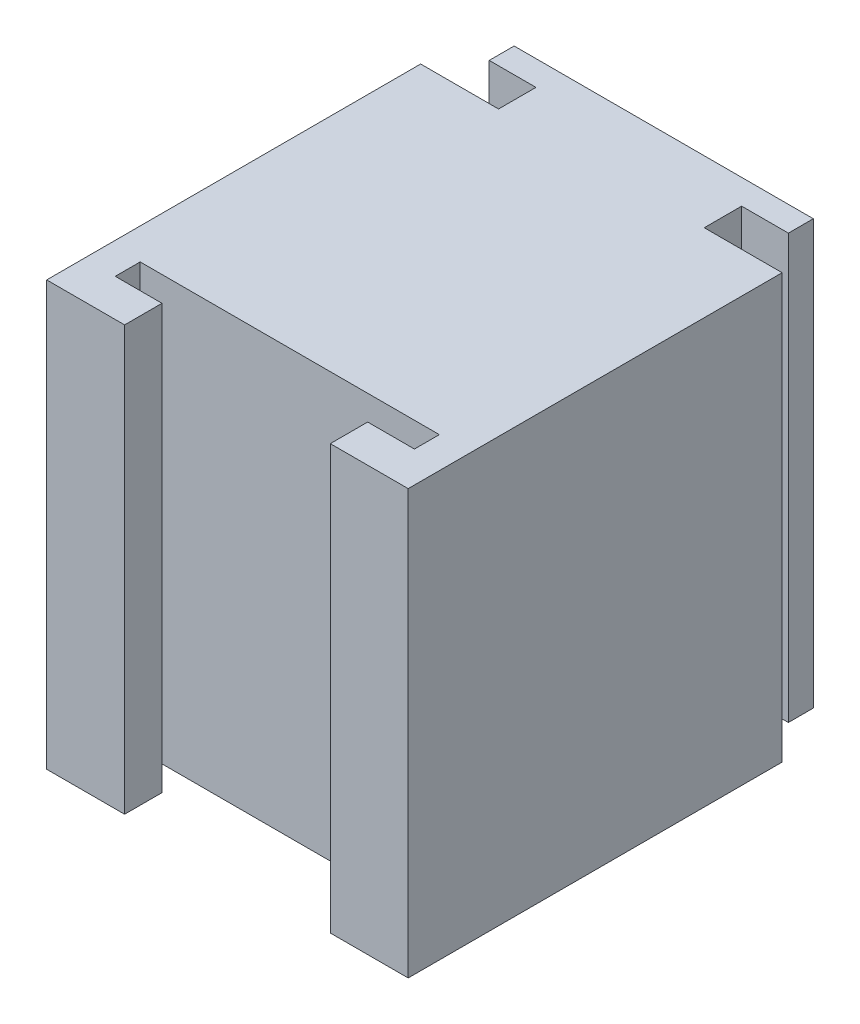
ISO-10303-21;
HEADER;
FILE_DESCRIPTION(('STEP AP214'),'2;1');
FILE_NAME('part.step','',(''),(''),'','','');
FILE_SCHEMA(('AUTOMOTIVE_DESIGN { 1 0 10303 214 1 1 1 1 }'));
ENDSEC;
DATA;
#1=APPLICATION_CONTEXT('core data for automotive mechanical design processes');
#2=APPLICATION_PROTOCOL_DEFINITION('international standard','automotive_design',2000,#1);
#3=PRODUCT_CONTEXT('',#1,'mechanical');
#4=PRODUCT('Part','Part','',(#3));
#5=PRODUCT_RELATED_PRODUCT_CATEGORY('part','',(#4));
#6=PRODUCT_DEFINITION_FORMATION('','',#4);
#7=PRODUCT_DEFINITION_CONTEXT('part definition',#1,'design');
#8=PRODUCT_DEFINITION('design','',#6,#7);
#9=PRODUCT_DEFINITION_SHAPE('','',#8);
#10=(LENGTH_UNIT() NAMED_UNIT(*) SI_UNIT(.MILLI.,.METRE.));
#11=(NAMED_UNIT(*) PLANE_ANGLE_UNIT() SI_UNIT($,.RADIAN.));
#12=(NAMED_UNIT(*) SI_UNIT($,.STERADIAN.) SOLID_ANGLE_UNIT());
#13=UNCERTAINTY_MEASURE_WITH_UNIT(LENGTH_MEASURE(1.E-05),#10,'distance_accuracy_value','');
#14=(GEOMETRIC_REPRESENTATION_CONTEXT(3) GLOBAL_UNCERTAINTY_ASSIGNED_CONTEXT((#13)) GLOBAL_UNIT_ASSIGNED_CONTEXT((#10,
#11,#12)) REPRESENTATION_CONTEXT('',''));
#15=CARTESIAN_POINT('',(0.,0.,0.));
#16=DIRECTION('',(0.,0.,1.));
#17=DIRECTION('',(1.,0.,0.));
#18=AXIS2_PLACEMENT_3D('',#15,#16,#17);
#19=CARTESIAN_POINT('',(8.25,17.,15.));
#20=DIRECTION('',(0.,0.,-1.));
#21=DIRECTION('',(-1.,0.,0.));
#22=AXIS2_PLACEMENT_3D('',#19,#20,#21);
#23=PLANE('',#22);
#24=DIRECTION('',(1.,0.,0.));
#25=VECTOR('',#24,1.);
#26=CARTESIAN_POINT('',(8.25,-17.,15.));
#27=LINE('',#26,#25);
#28=CARTESIAN_POINT('',(8.25,-17.,15.));
#29=VERTEX_POINT('',#28);
#30=CARTESIAN_POINT('',(14.5,-17.,15.));
#31=VERTEX_POINT('',#30);
#32=EDGE_CURVE('E203',#29,#31,#27,.T.);
#33=ORIENTED_EDGE('',*,*,#32,.T.);
#34=DIRECTION('',(0.,-1.,0.));
#35=VECTOR('',#34,1.);
#36=CARTESIAN_POINT('',(14.5,17.,15.));
#37=LINE('',#36,#35);
#38=CARTESIAN_POINT('',(14.5,17.,15.));
#39=VERTEX_POINT('',#38);
#40=EDGE_CURVE('E11',#39,#31,#37,.T.);
#41=ORIENTED_EDGE('',*,*,#40,.F.);
#42=DIRECTION('',(1.,0.,0.));
#43=VECTOR('',#42,1.);
#44=CARTESIAN_POINT('',(8.25,17.,15.));
#45=LINE('',#44,#43);
#46=CARTESIAN_POINT('',(8.25,17.,15.));
#47=VERTEX_POINT('',#46);
#48=EDGE_CURVE('E241',#47,#39,#45,.T.);
#49=ORIENTED_EDGE('',*,*,#48,.F.);
#50=DIRECTION('',(0.,-1.,0.));
#51=VECTOR('',#50,1.);
#52=CARTESIAN_POINT('',(8.25,17.,15.));
#53=LINE('',#52,#51);
#54=EDGE_CURVE('E199',#47,#29,#53,.T.);
#55=ORIENTED_EDGE('',*,*,#54,.T.);
#56=EDGE_LOOP('',(#33,#41,#49,#55));
#57=FACE_BOUND('',#56,.T.);
#58=ADVANCED_FACE('F35',(#57),#23,.F.);
#59=CARTESIAN_POINT('',(14.5,17.,-15.));
#60=DIRECTION('',(-1.,0.,0.));
#61=DIRECTION('',(0.,0.,1.));
#62=AXIS2_PLACEMENT_3D('',#59,#60,#61);
#63=PLANE('',#62);
#64=DIRECTION('',(0.,0.,-1.));
#65=VECTOR('',#64,1.);
#66=CARTESIAN_POINT('',(14.5,-17.,-15.));
#67=LINE('',#66,#65);
#68=CARTESIAN_POINT('',(14.5,-17.,-15.));
#69=VERTEX_POINT('',#68);
#70=EDGE_CURVE('E206',#31,#69,#67,.T.);
#71=ORIENTED_EDGE('',*,*,#70,.T.);
#72=DIRECTION('',(0.,-1.,0.));
#73=VECTOR('',#72,1.);
#74=CARTESIAN_POINT('',(14.5,17.,-15.));
#75=LINE('',#74,#73);
#76=CARTESIAN_POINT('',(14.5,17.,-15.));
#77=VERTEX_POINT('',#76);
#78=EDGE_CURVE('E43',#77,#69,#75,.T.);
#79=ORIENTED_EDGE('',*,*,#78,.F.);
#80=DIRECTION('',(0.,0.,-1.));
#81=VECTOR('',#80,1.);
#82=CARTESIAN_POINT('',(14.5,17.,-15.));
#83=LINE('',#82,#81);
#84=EDGE_CURVE('E130',#39,#77,#83,.T.);
#85=ORIENTED_EDGE('',*,*,#84,.F.);
#86=ORIENTED_EDGE('',*,*,#40,.T.);
#87=EDGE_LOOP('',(#71,#79,#85,#86));
#88=FACE_BOUND('',#87,.T.);
#89=ADVANCED_FACE('F359',(#88),#63,.F.);
#90=CARTESIAN_POINT('',(8.25,17.,-15.));
#91=DIRECTION('',(0.,0.,1.));
#92=DIRECTION('',(1.,0.,0.));
#93=AXIS2_PLACEMENT_3D('',#90,#91,#92);
#94=PLANE('',#93);
#95=DIRECTION('',(-1.,0.,0.));
#96=VECTOR('',#95,1.);
#97=CARTESIAN_POINT('',(8.25,-17.,-15.));
#98=LINE('',#97,#96);
#99=CARTESIAN_POINT('',(8.25,-17.,-15.));
#100=VERTEX_POINT('',#99);
#101=EDGE_CURVE('E208',#69,#100,#98,.T.);
#102=ORIENTED_EDGE('',*,*,#101,.T.);
#103=DIRECTION('',(0.,-1.,0.));
#104=VECTOR('',#103,1.);
#105=CARTESIAN_POINT('',(8.25,17.,-15.));
#106=LINE('',#105,#104);
#107=CARTESIAN_POINT('',(8.25,17.,-15.));
#108=VERTEX_POINT('',#107);
#109=EDGE_CURVE('E284',#108,#100,#106,.T.);
#110=ORIENTED_EDGE('',*,*,#109,.F.);
#111=DIRECTION('',(-1.,0.,0.));
#112=VECTOR('',#111,1.);
#113=CARTESIAN_POINT('',(8.25,17.,-15.));
#114=LINE('',#113,#112);
#115=EDGE_CURVE('E292',#77,#108,#114,.T.);
#116=ORIENTED_EDGE('',*,*,#115,.F.);
#117=ORIENTED_EDGE('',*,*,#78,.T.);
#118=EDGE_LOOP('',(#102,#110,#116,#117));
#119=FACE_BOUND('',#118,.T.);
#120=ADVANCED_FACE('F290',(#119),#94,.F.);
#121=CARTESIAN_POINT('',(8.25,17.,-18.));
#122=DIRECTION('',(-1.,0.,0.));
#123=DIRECTION('',(0.,0.,1.));
#124=AXIS2_PLACEMENT_3D('',#121,#122,#123);
#125=PLANE('',#124);
#126=DIRECTION('',(0.,0.,-1.));
#127=VECTOR('',#126,1.);
#128=CARTESIAN_POINT('',(8.25,-17.,-18.));
#129=LINE('',#128,#127);
#130=CARTESIAN_POINT('',(8.25,-17.,-18.));
#131=VERTEX_POINT('',#130);
#132=EDGE_CURVE('E210',#100,#131,#129,.T.);
#133=ORIENTED_EDGE('',*,*,#132,.T.);
#134=DIRECTION('',(0.,-1.,0.));
#135=VECTOR('',#134,1.);
#136=CARTESIAN_POINT('',(8.25,17.,-18.));
#137=LINE('',#136,#135);
#138=CARTESIAN_POINT('',(8.25,17.,-18.));
#139=VERTEX_POINT('',#138);
#140=EDGE_CURVE('E281',#139,#131,#137,.T.);
#141=ORIENTED_EDGE('',*,*,#140,.F.);
#142=DIRECTION('',(0.,0.,-1.));
#143=VECTOR('',#142,1.);
#144=CARTESIAN_POINT('',(8.25,17.,-18.));
#145=LINE('',#144,#143);
#146=EDGE_CURVE('E310',#108,#139,#145,.T.);
#147=ORIENTED_EDGE('',*,*,#146,.F.);
#148=ORIENTED_EDGE('',*,*,#109,.T.);
#149=EDGE_LOOP('',(#133,#141,#147,#148));
#150=FACE_BOUND('',#149,.T.);
#151=ADVANCED_FACE('F301',(#150),#125,.F.);
#152=CARTESIAN_POINT('',(12.,17.,-18.));
#153=DIRECTION('',(0.,0.,-1.));
#154=DIRECTION('',(-1.,0.,0.));
#155=AXIS2_PLACEMENT_3D('',#152,#153,#154);
#156=PLANE('',#155);
#157=DIRECTION('',(1.,0.,0.));
#158=VECTOR('',#157,1.);
#159=CARTESIAN_POINT('',(12.,-17.,-18.));
#160=LINE('',#159,#158);
#161=CARTESIAN_POINT('',(12.,-17.,-18.));
#162=VERTEX_POINT('',#161);
#163=EDGE_CURVE('E212',#131,#162,#160,.T.);
#164=ORIENTED_EDGE('',*,*,#163,.T.);
#165=DIRECTION('',(0.,-1.,0.));
#166=VECTOR('',#165,1.);
#167=CARTESIAN_POINT('',(12.,17.,-18.));
#168=LINE('',#167,#166);
#169=CARTESIAN_POINT('',(12.,17.,-18.));
#170=VERTEX_POINT('',#169);
#171=EDGE_CURVE('E278',#170,#162,#168,.T.);
#172=ORIENTED_EDGE('',*,*,#171,.F.);
#173=DIRECTION('',(1.,0.,0.));
#174=VECTOR('',#173,1.);
#175=CARTESIAN_POINT('',(12.,17.,-18.));
#176=LINE('',#175,#174);
#177=EDGE_CURVE('E307',#139,#170,#176,.T.);
#178=ORIENTED_EDGE('',*,*,#177,.F.);
#179=ORIENTED_EDGE('',*,*,#140,.T.);
#180=EDGE_LOOP('',(#164,#172,#178,#179));
#181=FACE_BOUND('',#180,.T.);
#182=ADVANCED_FACE('F305',(#181),#156,.F.);
#183=CARTESIAN_POINT('',(12.,17.,-20.));
#184=DIRECTION('',(-1.,0.,0.));
#185=DIRECTION('',(0.,0.,1.));
#186=AXIS2_PLACEMENT_3D('',#183,#184,#185);
#187=PLANE('',#186);
#188=DIRECTION('',(0.,0.,-1.));
#189=VECTOR('',#188,1.);
#190=CARTESIAN_POINT('',(12.,-17.,-20.));
#191=LINE('',#190,#189);
#192=CARTESIAN_POINT('',(12.,-17.,-20.));
#193=VERTEX_POINT('',#192);
#194=EDGE_CURVE('E214',#162,#193,#191,.T.);
#195=ORIENTED_EDGE('',*,*,#194,.T.);
#196=DIRECTION('',(0.,-1.,0.));
#197=VECTOR('',#196,1.);
#198=CARTESIAN_POINT('',(12.,17.,-20.));
#199=LINE('',#198,#197);
#200=CARTESIAN_POINT('',(12.,17.,-20.));
#201=VERTEX_POINT('',#200);
#202=EDGE_CURVE('E275',#201,#193,#199,.T.);
#203=ORIENTED_EDGE('',*,*,#202,.F.);
#204=DIRECTION('',(0.,0.,-1.));
#205=VECTOR('',#204,1.);
#206=CARTESIAN_POINT('',(12.,17.,-20.));
#207=LINE('',#206,#205);
#208=EDGE_CURVE('E309',#170,#201,#207,.T.);
#209=ORIENTED_EDGE('',*,*,#208,.F.);
#210=ORIENTED_EDGE('',*,*,#171,.T.);
#211=EDGE_LOOP('',(#195,#203,#209,#210));
#212=FACE_BOUND('',#211,.T.);
#213=ADVANCED_FACE('F372',(#212),#187,.F.);
#214=CARTESIAN_POINT('',(-12.,17.,-20.));
#215=DIRECTION('',(0.,0.,1.));
#216=DIRECTION('',(1.,0.,0.));
#217=AXIS2_PLACEMENT_3D('',#214,#215,#216);
#218=PLANE('',#217);
#219=DIRECTION('',(-1.,0.,0.));
#220=VECTOR('',#219,1.);
#221=CARTESIAN_POINT('',(-12.,-17.,-20.));
#222=LINE('',#221,#220);
#223=CARTESIAN_POINT('',(-12.,-17.,-20.));
#224=VERTEX_POINT('',#223);
#225=EDGE_CURVE('E216',#193,#224,#222,.T.);
#226=ORIENTED_EDGE('',*,*,#225,.T.);
#227=DIRECTION('',(0.,-1.,0.));
#228=VECTOR('',#227,1.);
#229=CARTESIAN_POINT('',(-12.,17.,-20.));
#230=LINE('',#229,#228);
#231=CARTESIAN_POINT('',(-12.,17.,-20.));
#232=VERTEX_POINT('',#231);
#233=EDGE_CURVE('E272',#232,#224,#230,.T.);
#234=ORIENTED_EDGE('',*,*,#233,.F.);
#235=DIRECTION('',(-1.,0.,0.));
#236=VECTOR('',#235,1.);
#237=CARTESIAN_POINT('',(-12.,17.,-20.));
#238=LINE('',#237,#236);
#239=EDGE_CURVE('E312',#201,#232,#238,.T.);
#240=ORIENTED_EDGE('',*,*,#239,.F.);
#241=ORIENTED_EDGE('',*,*,#202,.T.);
#242=EDGE_LOOP('',(#226,#234,#240,#241));
#243=FACE_BOUND('',#242,.T.);
#244=ADVANCED_FACE('F375',(#243),#218,.F.);
#245=CARTESIAN_POINT('',(-12.,17.,-18.));
#246=DIRECTION('',(1.,0.,0.));
#247=DIRECTION('',(0.,0.,-1.));
#248=AXIS2_PLACEMENT_3D('',#245,#246,#247);
#249=PLANE('',#248);
#250=DIRECTION('',(0.,0.,1.));
#251=VECTOR('',#250,1.);
#252=CARTESIAN_POINT('',(-12.,-17.,-18.));
#253=LINE('',#252,#251);
#254=CARTESIAN_POINT('',(-12.,-17.,-18.));
#255=VERTEX_POINT('',#254);
#256=EDGE_CURVE('E218',#224,#255,#253,.T.);
#257=ORIENTED_EDGE('',*,*,#256,.T.);
#258=DIRECTION('',(0.,-1.,0.));
#259=VECTOR('',#258,1.);
#260=CARTESIAN_POINT('',(-12.,17.,-18.));
#261=LINE('',#260,#259);
#262=CARTESIAN_POINT('',(-12.,17.,-18.));
#263=VERTEX_POINT('',#262);
#264=EDGE_CURVE('E269',#263,#255,#261,.T.);
#265=ORIENTED_EDGE('',*,*,#264,.F.);
#266=DIRECTION('',(0.,0.,1.));
#267=VECTOR('',#266,1.);
#268=CARTESIAN_POINT('',(-12.,17.,-18.));
#269=LINE('',#268,#267);
#270=EDGE_CURVE('E318',#232,#263,#269,.T.);
#271=ORIENTED_EDGE('',*,*,#270,.F.);
#272=ORIENTED_EDGE('',*,*,#233,.T.);
#273=EDGE_LOOP('',(#257,#265,#271,#272));
#274=FACE_BOUND('',#273,.T.);
#275=ADVANCED_FACE('F379',(#274),#249,.F.);
#276=CARTESIAN_POINT('',(-12.,17.,-18.));
#277=DIRECTION('',(0.,0.,-1.));
#278=DIRECTION('',(-1.,0.,0.));
#279=AXIS2_PLACEMENT_3D('',#276,#277,#278);
#280=PLANE('',#279);
#281=DIRECTION('',(1.,0.,0.));
#282=VECTOR('',#281,1.);
#283=CARTESIAN_POINT('',(-12.,-17.,-18.));
#284=LINE('',#283,#282);
#285=CARTESIAN_POINT('',(-8.25,-17.,-18.));
#286=VERTEX_POINT('',#285);
#287=EDGE_CURVE('E220',#255,#286,#284,.T.);
#288=ORIENTED_EDGE('',*,*,#287,.T.);
#289=DIRECTION('',(0.,-1.,0.));
#290=VECTOR('',#289,1.);
#291=CARTESIAN_POINT('',(-8.25,17.,-18.));
#292=LINE('',#291,#290);
#293=CARTESIAN_POINT('',(-8.25,17.,-18.));
#294=VERTEX_POINT('',#293);
#295=EDGE_CURVE('E266',#294,#286,#292,.T.);
#296=ORIENTED_EDGE('',*,*,#295,.F.);
#297=DIRECTION('',(1.,0.,0.));
#298=VECTOR('',#297,1.);
#299=CARTESIAN_POINT('',(-12.,17.,-18.));
#300=LINE('',#299,#298);
#301=EDGE_CURVE('E320',#263,#294,#300,.T.);
#302=ORIENTED_EDGE('',*,*,#301,.F.);
#303=ORIENTED_EDGE('',*,*,#264,.T.);
#304=EDGE_LOOP('',(#288,#296,#302,#303));
#305=FACE_BOUND('',#304,.T.);
#306=ADVANCED_FACE('F383',(#305),#280,.F.);
#307=CARTESIAN_POINT('',(-8.25,17.,-18.));
#308=DIRECTION('',(1.,0.,0.));
#309=DIRECTION('',(0.,0.,-1.));
#310=AXIS2_PLACEMENT_3D('',#307,#308,#309);
#311=PLANE('',#310);
#312=DIRECTION('',(0.,0.,1.));
#313=VECTOR('',#312,1.);
#314=CARTESIAN_POINT('',(-8.25,-17.,-18.));
#315=LINE('',#314,#313);
#316=CARTESIAN_POINT('',(-8.25,-17.,-15.));
#317=VERTEX_POINT('',#316);
#318=EDGE_CURVE('E222',#286,#317,#315,.T.);
#319=ORIENTED_EDGE('',*,*,#318,.T.);
#320=DIRECTION('',(0.,-1.,0.));
#321=VECTOR('',#320,1.);
#322=CARTESIAN_POINT('',(-8.25,17.,-15.));
#323=LINE('',#322,#321);
#324=CARTESIAN_POINT('',(-8.25,17.,-15.));
#325=VERTEX_POINT('',#324);
#326=EDGE_CURVE('E263',#325,#317,#323,.T.);
#327=ORIENTED_EDGE('',*,*,#326,.F.);
#328=DIRECTION('',(0.,0.,1.));
#329=VECTOR('',#328,1.);
#330=CARTESIAN_POINT('',(-8.25,17.,-18.));
#331=LINE('',#330,#329);
#332=EDGE_CURVE('E322',#294,#325,#331,.T.);
#333=ORIENTED_EDGE('',*,*,#332,.F.);
#334=ORIENTED_EDGE('',*,*,#295,.T.);
#335=EDGE_LOOP('',(#319,#327,#333,#334));
#336=FACE_BOUND('',#335,.T.);
#337=ADVANCED_FACE('F387',(#336),#311,.F.);
#338=CARTESIAN_POINT('',(-14.5,17.,-15.));
#339=DIRECTION('',(0.,0.,1.));
#340=DIRECTION('',(1.,0.,0.));
#341=AXIS2_PLACEMENT_3D('',#338,#339,#340);
#342=PLANE('',#341);
#343=DIRECTION('',(-1.,0.,0.));
#344=VECTOR('',#343,1.);
#345=CARTESIAN_POINT('',(-14.5,-17.,-15.));
#346=LINE('',#345,#344);
#347=CARTESIAN_POINT('',(-14.5,-17.,-15.));
#348=VERTEX_POINT('',#347);
#349=EDGE_CURVE('E224',#317,#348,#346,.T.);
#350=ORIENTED_EDGE('',*,*,#349,.T.);
#351=DIRECTION('',(0.,-1.,0.));
#352=VECTOR('',#351,1.);
#353=CARTESIAN_POINT('',(-14.5,17.,-15.));
#354=LINE('',#353,#352);
#355=CARTESIAN_POINT('',(-14.5,17.,-15.));
#356=VERTEX_POINT('',#355);
#357=EDGE_CURVE('E260',#356,#348,#354,.T.);
#358=ORIENTED_EDGE('',*,*,#357,.F.);
#359=DIRECTION('',(-1.,0.,0.));
#360=VECTOR('',#359,1.);
#361=CARTESIAN_POINT('',(-14.5,17.,-15.));
#362=LINE('',#361,#360);
#363=EDGE_CURVE('E324',#325,#356,#362,.T.);
#364=ORIENTED_EDGE('',*,*,#363,.F.);
#365=ORIENTED_EDGE('',*,*,#326,.T.);
#366=EDGE_LOOP('',(#350,#358,#364,#365));
#367=FACE_BOUND('',#366,.T.);
#368=ADVANCED_FACE('F391',(#367),#342,.F.);
#369=CARTESIAN_POINT('',(-14.5,17.,-15.));
#370=DIRECTION('',(1.,0.,0.));
#371=DIRECTION('',(0.,0.,-1.));
#372=AXIS2_PLACEMENT_3D('',#369,#370,#371);
#373=PLANE('',#372);
#374=DIRECTION('',(0.,0.,1.));
#375=VECTOR('',#374,1.);
#376=CARTESIAN_POINT('',(-14.5,-17.,-15.));
#377=LINE('',#376,#375);
#378=CARTESIAN_POINT('',(-14.5,-17.,15.));
#379=VERTEX_POINT('',#378);
#380=EDGE_CURVE('E226',#348,#379,#377,.T.);
#381=ORIENTED_EDGE('',*,*,#380,.T.);
#382=DIRECTION('',(0.,-1.,0.));
#383=VECTOR('',#382,1.);
#384=CARTESIAN_POINT('',(-14.5,17.,15.));
#385=LINE('',#384,#383);
#386=CARTESIAN_POINT('',(-14.5,17.,15.));
#387=VERTEX_POINT('',#386);
#388=EDGE_CURVE('E257',#387,#379,#385,.T.);
#389=ORIENTED_EDGE('',*,*,#388,.F.);
#390=DIRECTION('',(0.,0.,1.));
#391=VECTOR('',#390,1.);
#392=CARTESIAN_POINT('',(-14.5,17.,-15.));
#393=LINE('',#392,#391);
#394=EDGE_CURVE('E326',#356,#387,#393,.T.);
#395=ORIENTED_EDGE('',*,*,#394,.F.);
#396=ORIENTED_EDGE('',*,*,#357,.T.);
#397=EDGE_LOOP('',(#381,#389,#395,#396));
#398=FACE_BOUND('',#397,.T.);
#399=ADVANCED_FACE('F395',(#398),#373,.F.);
#400=CARTESIAN_POINT('',(-14.5,17.,15.));
#401=DIRECTION('',(0.,0.,-1.));
#402=DIRECTION('',(-1.,0.,0.));
#403=AXIS2_PLACEMENT_3D('',#400,#401,#402);
#404=PLANE('',#403);
#405=DIRECTION('',(1.,0.,0.));
#406=VECTOR('',#405,1.);
#407=CARTESIAN_POINT('',(-14.5,-17.,15.));
#408=LINE('',#407,#406);
#409=CARTESIAN_POINT('',(-8.25,-17.,15.));
#410=VERTEX_POINT('',#409);
#411=EDGE_CURVE('E228',#379,#410,#408,.T.);
#412=ORIENTED_EDGE('',*,*,#411,.T.);
#413=DIRECTION('',(0.,-1.,0.));
#414=VECTOR('',#413,1.);
#415=CARTESIAN_POINT('',(-8.25,17.,15.));
#416=LINE('',#415,#414);
#417=CARTESIAN_POINT('',(-8.25,17.,15.));
#418=VERTEX_POINT('',#417);
#419=EDGE_CURVE('E254',#418,#410,#416,.T.);
#420=ORIENTED_EDGE('',*,*,#419,.F.);
#421=DIRECTION('',(1.,0.,0.));
#422=VECTOR('',#421,1.);
#423=CARTESIAN_POINT('',(-14.5,17.,15.));
#424=LINE('',#423,#422);
#425=EDGE_CURVE('E328',#387,#418,#424,.T.);
#426=ORIENTED_EDGE('',*,*,#425,.F.);
#427=ORIENTED_EDGE('',*,*,#388,.T.);
#428=EDGE_LOOP('',(#412,#420,#426,#427));
#429=FACE_BOUND('',#428,.T.);
#430=ADVANCED_FACE('F399',(#429),#404,.F.);
#431=CARTESIAN_POINT('',(-8.25,17.,12.));
#432=DIRECTION('',(-1.,0.,0.));
#433=DIRECTION('',(0.,0.,1.));
#434=AXIS2_PLACEMENT_3D('',#431,#432,#433);
#435=PLANE('',#434);
#436=DIRECTION('',(0.,0.,-1.));
#437=VECTOR('',#436,1.);
#438=CARTESIAN_POINT('',(-8.25,-17.,12.));
#439=LINE('',#438,#437);
#440=CARTESIAN_POINT('',(-8.25,-17.,12.));
#441=VERTEX_POINT('',#440);
#442=EDGE_CURVE('E230',#410,#441,#439,.T.);
#443=ORIENTED_EDGE('',*,*,#442,.T.);
#444=DIRECTION('',(0.,-1.,0.));
#445=VECTOR('',#444,1.);
#446=CARTESIAN_POINT('',(-8.25,17.,12.));
#447=LINE('',#446,#445);
#448=CARTESIAN_POINT('',(-8.25,17.,12.));
#449=VERTEX_POINT('',#448);
#450=EDGE_CURVE('E251',#449,#441,#447,.T.);
#451=ORIENTED_EDGE('',*,*,#450,.F.);
#452=DIRECTION('',(0.,0.,-1.));
#453=VECTOR('',#452,1.);
#454=CARTESIAN_POINT('',(-8.25,17.,12.));
#455=LINE('',#454,#453);
#456=EDGE_CURVE('E330',#418,#449,#455,.T.);
#457=ORIENTED_EDGE('',*,*,#456,.F.);
#458=ORIENTED_EDGE('',*,*,#419,.T.);
#459=EDGE_LOOP('',(#443,#451,#457,#458));
#460=FACE_BOUND('',#459,.T.);
#461=ADVANCED_FACE('F403',(#460),#435,.F.);
#462=CARTESIAN_POINT('',(-12.,17.,12.));
#463=DIRECTION('',(0.,0.,1.));
#464=DIRECTION('',(1.,0.,0.));
#465=AXIS2_PLACEMENT_3D('',#462,#463,#464);
#466=PLANE('',#465);
#467=DIRECTION('',(-1.,0.,0.));
#468=VECTOR('',#467,1.);
#469=CARTESIAN_POINT('',(-12.,-17.,12.));
#470=LINE('',#469,#468);
#471=CARTESIAN_POINT('',(-12.,-17.,12.));
#472=VERTEX_POINT('',#471);
#473=EDGE_CURVE('E232',#441,#472,#470,.T.);
#474=ORIENTED_EDGE('',*,*,#473,.T.);
#475=DIRECTION('',(0.,-1.,0.));
#476=VECTOR('',#475,1.);
#477=CARTESIAN_POINT('',(-12.,17.,12.));
#478=LINE('',#477,#476);
#479=CARTESIAN_POINT('',(-12.,17.,12.));
#480=VERTEX_POINT('',#479);
#481=EDGE_CURVE('E248',#480,#472,#478,.T.);
#482=ORIENTED_EDGE('',*,*,#481,.F.);
#483=DIRECTION('',(-1.,0.,0.));
#484=VECTOR('',#483,1.);
#485=CARTESIAN_POINT('',(-12.,17.,12.));
#486=LINE('',#485,#484);
#487=EDGE_CURVE('E332',#449,#480,#486,.T.);
#488=ORIENTED_EDGE('',*,*,#487,.F.);
#489=ORIENTED_EDGE('',*,*,#450,.T.);
#490=EDGE_LOOP('',(#474,#482,#488,#489));
#491=FACE_BOUND('',#490,.T.);
#492=ADVANCED_FACE('F407',(#491),#466,.F.);
#493=CARTESIAN_POINT('',(-12.,17.,10.));
#494=DIRECTION('',(-1.,0.,0.));
#495=DIRECTION('',(0.,0.,1.));
#496=AXIS2_PLACEMENT_3D('',#493,#494,#495);
#497=PLANE('',#496);
#498=DIRECTION('',(0.,0.,-1.));
#499=VECTOR('',#498,1.);
#500=CARTESIAN_POINT('',(-12.,-17.,10.));
#501=LINE('',#500,#499);
#502=CARTESIAN_POINT('',(-12.,-17.,10.));
#503=VERTEX_POINT('',#502);
#504=EDGE_CURVE('E234',#472,#503,#501,.T.);
#505=ORIENTED_EDGE('',*,*,#504,.T.);
#506=DIRECTION('',(0.,-1.,0.));
#507=VECTOR('',#506,1.);
#508=CARTESIAN_POINT('',(-12.,17.,10.));
#509=LINE('',#508,#507);
#510=CARTESIAN_POINT('',(-12.,17.,10.));
#511=VERTEX_POINT('',#510);
#512=EDGE_CURVE('E245',#511,#503,#509,.T.);
#513=ORIENTED_EDGE('',*,*,#512,.F.);
#514=DIRECTION('',(0.,0.,-1.));
#515=VECTOR('',#514,1.);
#516=CARTESIAN_POINT('',(-12.,17.,10.));
#517=LINE('',#516,#515);
#518=EDGE_CURVE('E334',#480,#511,#517,.T.);
#519=ORIENTED_EDGE('',*,*,#518,.F.);
#520=ORIENTED_EDGE('',*,*,#481,.T.);
#521=EDGE_LOOP('',(#505,#513,#519,#520));
#522=FACE_BOUND('',#521,.T.);
#523=ADVANCED_FACE('F340',(#522),#497,.F.);
#524=CARTESIAN_POINT('',(-12.,17.,10.));
#525=DIRECTION('',(0.,0.,-1.));
#526=DIRECTION('',(-1.,0.,0.));
#527=AXIS2_PLACEMENT_3D('',#524,#525,#526);
#528=PLANE('',#527);
#529=DIRECTION('',(1.,0.,0.));
#530=VECTOR('',#529,1.);
#531=CARTESIAN_POINT('',(-12.,-17.,10.));
#532=LINE('',#531,#530);
#533=CARTESIAN_POINT('',(12.,-17.,10.));
#534=VERTEX_POINT('',#533);
#535=EDGE_CURVE('E236',#503,#534,#532,.T.);
#536=ORIENTED_EDGE('',*,*,#535,.T.);
#537=DIRECTION('',(0.,-1.,0.));
#538=VECTOR('',#537,1.);
#539=CARTESIAN_POINT('',(12.,17.,10.));
#540=LINE('',#539,#538);
#541=CARTESIAN_POINT('',(12.,17.,10.));
#542=VERTEX_POINT('',#541);
#543=EDGE_CURVE('E194',#542,#534,#540,.T.);
#544=ORIENTED_EDGE('',*,*,#543,.F.);
#545=DIRECTION('',(1.,0.,0.));
#546=VECTOR('',#545,1.);
#547=CARTESIAN_POINT('',(-12.,17.,10.));
#548=LINE('',#547,#546);
#549=EDGE_CURVE('E185',#511,#542,#548,.T.);
#550=ORIENTED_EDGE('',*,*,#549,.F.);
#551=ORIENTED_EDGE('',*,*,#512,.T.);
#552=EDGE_LOOP('',(#536,#544,#550,#551));
#553=FACE_BOUND('',#552,.T.);
#554=ADVANCED_FACE('F344',(#553),#528,.F.);
#555=CARTESIAN_POINT('',(12.,17.,10.));
#556=DIRECTION('',(1.,0.,0.));
#557=DIRECTION('',(0.,0.,-1.));
#558=AXIS2_PLACEMENT_3D('',#555,#556,#557);
#559=PLANE('',#558);
#560=DIRECTION('',(0.,0.,1.));
#561=VECTOR('',#560,1.);
#562=CARTESIAN_POINT('',(12.,-17.,10.));
#563=LINE('',#562,#561);
#564=CARTESIAN_POINT('',(12.,-17.,12.));
#565=VERTEX_POINT('',#564);
#566=EDGE_CURVE('E193',#534,#565,#563,.T.);
#567=ORIENTED_EDGE('',*,*,#566,.T.);
#568=DIRECTION('',(0.,-1.,0.));
#569=VECTOR('',#568,1.);
#570=CARTESIAN_POINT('',(12.,17.,12.));
#571=LINE('',#570,#569);
#572=CARTESIAN_POINT('',(12.,17.,12.));
#573=VERTEX_POINT('',#572);
#574=EDGE_CURVE('E190',#573,#565,#571,.T.);
#575=ORIENTED_EDGE('',*,*,#574,.F.);
#576=DIRECTION('',(0.,0.,1.));
#577=VECTOR('',#576,1.);
#578=CARTESIAN_POINT('',(12.,17.,10.));
#579=LINE('',#578,#577);
#580=EDGE_CURVE('E179',#542,#573,#579,.T.);
#581=ORIENTED_EDGE('',*,*,#580,.F.);
#582=ORIENTED_EDGE('',*,*,#543,.T.);
#583=EDGE_LOOP('',(#567,#575,#581,#582));
#584=FACE_BOUND('',#583,.T.);
#585=ADVANCED_FACE('F191',(#584),#559,.F.);
#586=CARTESIAN_POINT('',(12.,17.,12.));
#587=DIRECTION('',(0.,0.,1.));
#588=DIRECTION('',(1.,0.,0.));
#589=AXIS2_PLACEMENT_3D('',#586,#587,#588);
#590=PLANE('',#589);
#591=DIRECTION('',(-1.,0.,0.));
#592=VECTOR('',#591,1.);
#593=CARTESIAN_POINT('',(12.,-17.,12.));
#594=LINE('',#593,#592);
#595=CARTESIAN_POINT('',(8.25,-17.,12.));
#596=VERTEX_POINT('',#595);
#597=EDGE_CURVE('E116',#565,#596,#594,.T.);
#598=ORIENTED_EDGE('',*,*,#597,.T.);
#599=DIRECTION('',(0.,-1.,0.));
#600=VECTOR('',#599,1.);
#601=CARTESIAN_POINT('',(8.25,17.,12.));
#602=LINE('',#601,#600);
#603=CARTESIAN_POINT('',(8.25,17.,12.));
#604=VERTEX_POINT('',#603);
#605=EDGE_CURVE('E195',#604,#596,#602,.T.);
#606=ORIENTED_EDGE('',*,*,#605,.F.);
#607=DIRECTION('',(-1.,0.,0.));
#608=VECTOR('',#607,1.);
#609=CARTESIAN_POINT('',(12.,17.,12.));
#610=LINE('',#609,#608);
#611=EDGE_CURVE('E183',#573,#604,#610,.T.);
#612=ORIENTED_EDGE('',*,*,#611,.F.);
#613=ORIENTED_EDGE('',*,*,#574,.T.);
#614=EDGE_LOOP('',(#598,#606,#612,#613));
#615=FACE_BOUND('',#614,.T.);
#616=ADVANCED_FACE('F197',(#615),#590,.F.);
#617=CARTESIAN_POINT('',(8.25,17.,12.));
#618=DIRECTION('',(1.,0.,0.));
#619=DIRECTION('',(0.,0.,-1.));
#620=AXIS2_PLACEMENT_3D('',#617,#618,#619);
#621=PLANE('',#620);
#622=DIRECTION('',(0.,0.,1.));
#623=VECTOR('',#622,1.);
#624=CARTESIAN_POINT('',(8.25,-17.,12.));
#625=LINE('',#624,#623);
#626=EDGE_CURVE('E122',#596,#29,#625,.T.);
#627=ORIENTED_EDGE('',*,*,#626,.T.);
#628=ORIENTED_EDGE('',*,*,#54,.F.);
#629=DIRECTION('',(0.,0.,1.));
#630=VECTOR('',#629,1.);
#631=CARTESIAN_POINT('',(8.25,17.,12.));
#632=LINE('',#631,#630);
#633=EDGE_CURVE('E51',#604,#47,#632,.T.);
#634=ORIENTED_EDGE('',*,*,#633,.F.);
#635=ORIENTED_EDGE('',*,*,#605,.T.);
#636=EDGE_LOOP('',(#627,#628,#634,#635));
#637=FACE_BOUND('',#636,.T.);
#638=ADVANCED_FACE('F348',(#637),#621,.F.);
#639=CARTESIAN_POINT('',(0.,17.,0.));
#640=DIRECTION('',(0.,-1.,0.));
#641=DIRECTION('',(0.,0.,-1.));
#642=AXIS2_PLACEMENT_3D('',#639,#640,#641);
#643=PLANE('',#642);
#644=ORIENTED_EDGE('',*,*,#48,.T.);
#645=ORIENTED_EDGE('',*,*,#84,.T.);
#646=ORIENTED_EDGE('',*,*,#115,.T.);
#647=ORIENTED_EDGE('',*,*,#146,.T.);
#648=ORIENTED_EDGE('',*,*,#177,.T.);
#649=ORIENTED_EDGE('',*,*,#208,.T.);
#650=ORIENTED_EDGE('',*,*,#239,.T.);
#651=ORIENTED_EDGE('',*,*,#270,.T.);
#652=ORIENTED_EDGE('',*,*,#301,.T.);
#653=ORIENTED_EDGE('',*,*,#332,.T.);
#654=ORIENTED_EDGE('',*,*,#363,.T.);
#655=ORIENTED_EDGE('',*,*,#394,.T.);
#656=ORIENTED_EDGE('',*,*,#425,.T.);
#657=ORIENTED_EDGE('',*,*,#456,.T.);
#658=ORIENTED_EDGE('',*,*,#487,.T.);
#659=ORIENTED_EDGE('',*,*,#518,.T.);
#660=ORIENTED_EDGE('',*,*,#549,.T.);
#661=ORIENTED_EDGE('',*,*,#580,.T.);
#662=ORIENTED_EDGE('',*,*,#611,.T.);
#663=ORIENTED_EDGE('',*,*,#633,.T.);
#664=EDGE_LOOP('',(#644,#645,#646,#647,#648,#649,#650,#651,#652,#653,#654,#655,#656,#657,#658,
#659,#660,#661,#662,#663));
#665=FACE_BOUND('',#664,.T.);
#666=ADVANCED_FACE('F181',(#665),#643,.F.);
#667=CARTESIAN_POINT('',(0.,-17.,0.));
#668=DIRECTION('',(0.,-1.,0.));
#669=DIRECTION('',(0.,0.,-1.));
#670=AXIS2_PLACEMENT_3D('',#667,#668,#669);
#671=PLANE('',#670);
#672=ORIENTED_EDGE('',*,*,#32,.F.);
#673=ORIENTED_EDGE('',*,*,#626,.F.);
#674=ORIENTED_EDGE('',*,*,#597,.F.);
#675=ORIENTED_EDGE('',*,*,#566,.F.);
#676=ORIENTED_EDGE('',*,*,#535,.F.);
#677=ORIENTED_EDGE('',*,*,#504,.F.);
#678=ORIENTED_EDGE('',*,*,#473,.F.);
#679=ORIENTED_EDGE('',*,*,#442,.F.);
#680=ORIENTED_EDGE('',*,*,#411,.F.);
#681=ORIENTED_EDGE('',*,*,#380,.F.);
#682=ORIENTED_EDGE('',*,*,#349,.F.);
#683=ORIENTED_EDGE('',*,*,#318,.F.);
#684=ORIENTED_EDGE('',*,*,#287,.F.);
#685=ORIENTED_EDGE('',*,*,#256,.F.);
#686=ORIENTED_EDGE('',*,*,#225,.F.);
#687=ORIENTED_EDGE('',*,*,#194,.F.);
#688=ORIENTED_EDGE('',*,*,#163,.F.);
#689=ORIENTED_EDGE('',*,*,#132,.F.);
#690=ORIENTED_EDGE('',*,*,#101,.F.);
#691=ORIENTED_EDGE('',*,*,#70,.F.);
#692=EDGE_LOOP('',(#672,#673,#674,#675,#676,#677,#678,#679,#680,#681,#682,#683,#684,#685,#686,
#687,#688,#689,#690,#691));
#693=FACE_BOUND('',#692,.T.);
#694=ADVANCED_FACE('F296',(#693),#671,.T.);
#695=CLOSED_SHELL('',(#58,#89,#120,#151,#182,#213,#244,#275,#306,#337,#368,#399,#430,#461,#492,
#523,#554,#585,#616,#638,#666,#694));
#696=MANIFOLD_SOLID_BREP('B2',#695);
#697=ADVANCED_BREP_SHAPE_REPRESENTATION('',(#18,#696),#14);
#698=SHAPE_DEFINITION_REPRESENTATION(#9,#697);
ENDSEC;
END-ISO-10303-21;
